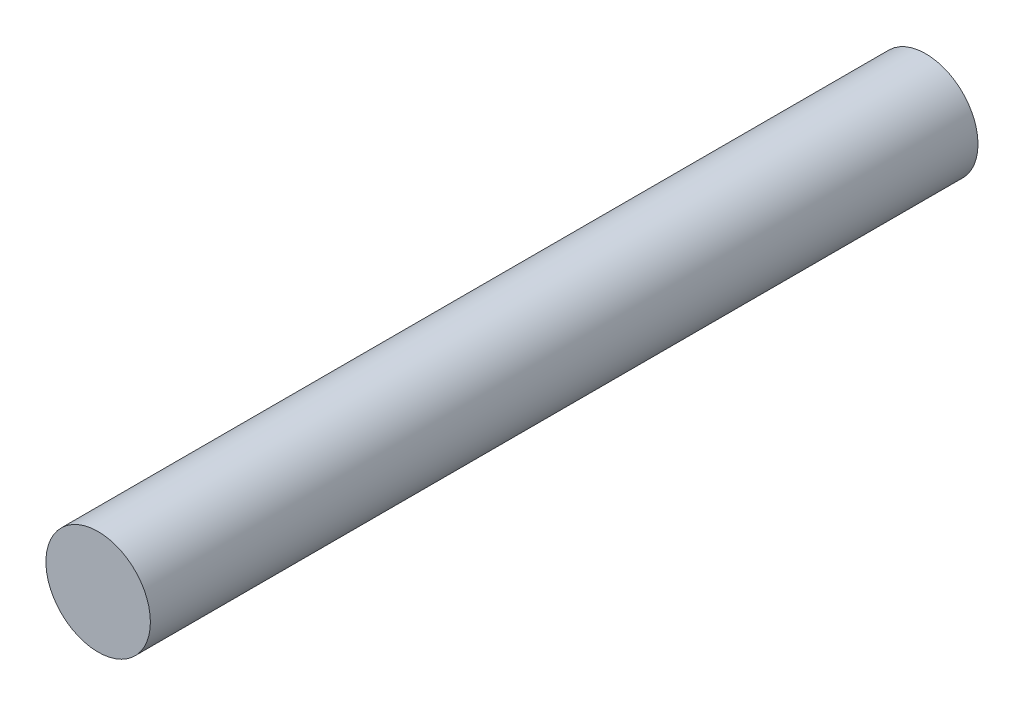
ISO-10303-21;
HEADER;
FILE_DESCRIPTION(('STEP AP214'),'2;1');
FILE_NAME('part.step','',(''),(''),'','','');
FILE_SCHEMA(('AUTOMOTIVE_DESIGN { 1 0 10303 214 1 1 1 1 }'));
ENDSEC;
DATA;
#1=APPLICATION_CONTEXT('core data for automotive mechanical design processes');
#2=APPLICATION_PROTOCOL_DEFINITION('international standard','automotive_design',2000,#1);
#3=PRODUCT_CONTEXT('',#1,'mechanical');
#4=PRODUCT('Part','Part','',(#3));
#5=PRODUCT_RELATED_PRODUCT_CATEGORY('part','',(#4));
#6=PRODUCT_DEFINITION_FORMATION('','',#4);
#7=PRODUCT_DEFINITION_CONTEXT('part definition',#1,'design');
#8=PRODUCT_DEFINITION('design','',#6,#7);
#9=PRODUCT_DEFINITION_SHAPE('','',#8);
#10=(LENGTH_UNIT() NAMED_UNIT(*) SI_UNIT(.MILLI.,.METRE.));
#11=(NAMED_UNIT(*) PLANE_ANGLE_UNIT() SI_UNIT($,.RADIAN.));
#12=(NAMED_UNIT(*) SI_UNIT($,.STERADIAN.) SOLID_ANGLE_UNIT());
#13=UNCERTAINTY_MEASURE_WITH_UNIT(LENGTH_MEASURE(1.E-05),#10,'distance_accuracy_value','');
#14=(GEOMETRIC_REPRESENTATION_CONTEXT(3) GLOBAL_UNCERTAINTY_ASSIGNED_CONTEXT((#13)) GLOBAL_UNIT_ASSIGNED_CONTEXT((#10,
#11,#12)) REPRESENTATION_CONTEXT('',''));
#15=CARTESIAN_POINT('',(0.,0.,0.));
#16=DIRECTION('',(0.,0.,1.));
#17=DIRECTION('',(1.,0.,0.));
#18=AXIS2_PLACEMENT_3D('',#15,#16,#17);
#19=CARTESIAN_POINT('',(0.,0.,10.2616));
#20=DIRECTION('',(0.,0.,-1.));
#21=DIRECTION('',(-1.,0.,0.));
#22=AXIS2_PLACEMENT_3D('',#19,#20,#21);
#23=CYLINDRICAL_SURFACE('',#22,0.6477);
#24=CARTESIAN_POINT('',(0.,0.,10.2616));
#25=DIRECTION('',(0.,0.,1.));
#26=DIRECTION('',(1.,0.,0.));
#27=AXIS2_PLACEMENT_3D('',#24,#25,#26);
#28=CIRCLE('',#27,0.6477);
#29=CARTESIAN_POINT('',(0.6477,0.,10.2616));
#30=VERTEX_POINT('',#29);
#31=EDGE_CURVE('E10',#30,#30,#28,.T.);
#32=ORIENTED_EDGE('',*,*,#31,.F.);
#33=EDGE_LOOP('',(#32));
#34=FACE_BOUND('',#33,.T.);
#35=CARTESIAN_POINT('',(0.,0.,0.));
#36=DIRECTION('',(0.,0.,1.));
#37=DIRECTION('',(1.,0.,0.));
#38=AXIS2_PLACEMENT_3D('',#35,#36,#37);
#39=CIRCLE('',#38,0.6477);
#40=CARTESIAN_POINT('',(0.6477,0.,0.));
#41=VERTEX_POINT('',#40);
#42=EDGE_CURVE('E34',#41,#41,#39,.T.);
#43=ORIENTED_EDGE('',*,*,#42,.T.);
#44=EDGE_LOOP('',(#43));
#45=FACE_BOUND('',#44,.T.);
#46=ADVANCED_FACE('F31',(#34,#45),#23,.T.);
#47=CARTESIAN_POINT('',(0.,0.,10.2616));
#48=DIRECTION('',(0.,0.,1.));
#49=DIRECTION('',(1.,0.,0.));
#50=AXIS2_PLACEMENT_3D('',#47,#48,#49);
#51=PLANE('',#50);
#52=ORIENTED_EDGE('',*,*,#31,.T.);
#53=EDGE_LOOP('',(#52));
#54=FACE_BOUND('',#53,.T.);
#55=ADVANCED_FACE('F46',(#54),#51,.T.);
#56=CARTESIAN_POINT('',(0.,0.,0.));
#57=DIRECTION('',(0.,0.,1.));
#58=DIRECTION('',(1.,0.,0.));
#59=AXIS2_PLACEMENT_3D('',#56,#57,#58);
#60=PLANE('',#59);
#61=ORIENTED_EDGE('',*,*,#42,.F.);
#62=EDGE_LOOP('',(#61));
#63=FACE_BOUND('',#62,.T.);
#64=ADVANCED_FACE('F44',(#63),#60,.F.);
#65=CLOSED_SHELL('',(#46,#55,#64));
#66=MANIFOLD_SOLID_BREP('B2',#65);
#67=ADVANCED_BREP_SHAPE_REPRESENTATION('',(#18,#66),#14);
#68=SHAPE_DEFINITION_REPRESENTATION(#9,#67);
ENDSEC;
END-ISO-10303-21;
